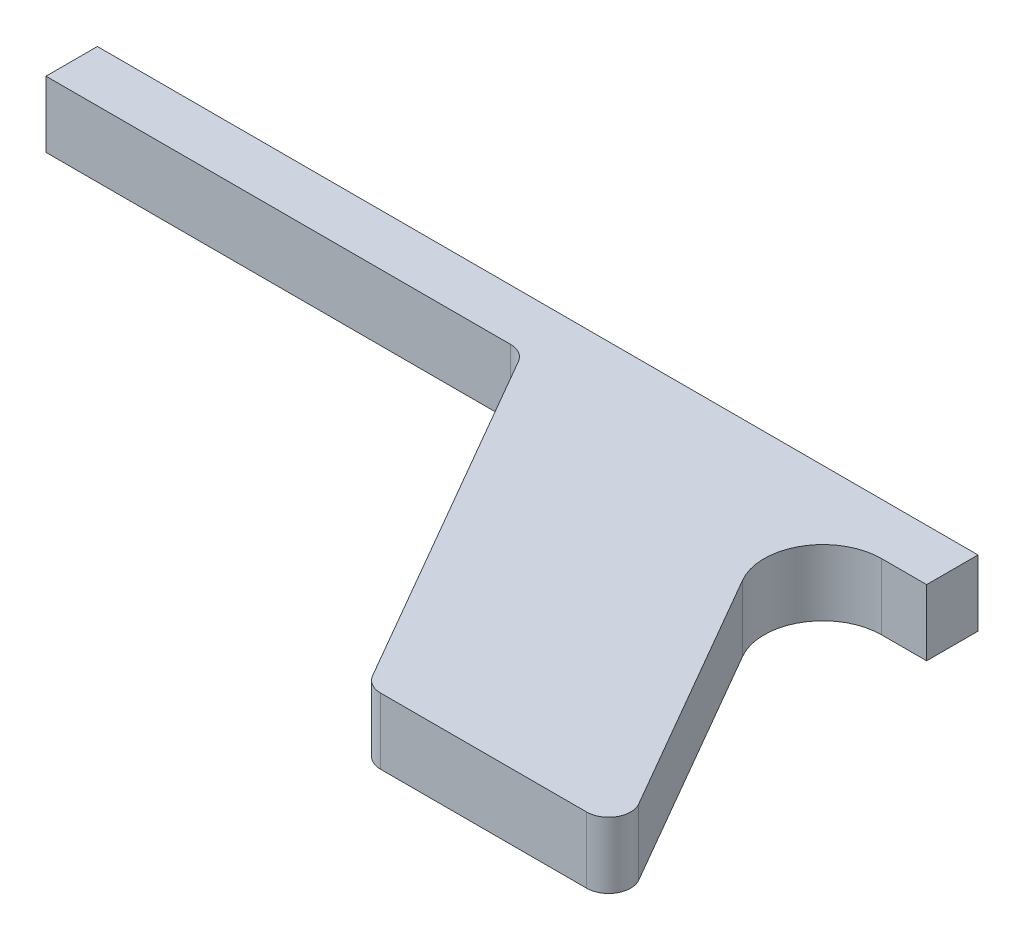
ISO-10303-21;
HEADER;
FILE_DESCRIPTION(('STEP AP214'),'2;1');
FILE_NAME('part.step','',(''),(''),'','','');
FILE_SCHEMA(('AUTOMOTIVE_DESIGN { 1 0 10303 214 1 1 1 1 }'));
ENDSEC;
DATA;
#1=APPLICATION_CONTEXT('core data for automotive mechanical design processes');
#2=APPLICATION_PROTOCOL_DEFINITION('international standard','automotive_design',2000,#1);
#3=PRODUCT_CONTEXT('',#1,'mechanical');
#4=PRODUCT('Part','Part','',(#3));
#5=PRODUCT_RELATED_PRODUCT_CATEGORY('part','',(#4));
#6=PRODUCT_DEFINITION_FORMATION('','',#4);
#7=PRODUCT_DEFINITION_CONTEXT('part definition',#1,'design');
#8=PRODUCT_DEFINITION('design','',#6,#7);
#9=PRODUCT_DEFINITION_SHAPE('','',#8);
#10=(LENGTH_UNIT() NAMED_UNIT(*) SI_UNIT(.MILLI.,.METRE.));
#11=(NAMED_UNIT(*) PLANE_ANGLE_UNIT() SI_UNIT($,.RADIAN.));
#12=(NAMED_UNIT(*) SI_UNIT($,.STERADIAN.) SOLID_ANGLE_UNIT());
#13=UNCERTAINTY_MEASURE_WITH_UNIT(LENGTH_MEASURE(1.E-05),#10,'distance_accuracy_value','');
#14=(GEOMETRIC_REPRESENTATION_CONTEXT(3) GLOBAL_UNCERTAINTY_ASSIGNED_CONTEXT((#13)) GLOBAL_UNIT_ASSIGNED_CONTEXT((#10,
#11,#12)) REPRESENTATION_CONTEXT('',''));
#15=CARTESIAN_POINT('',(0.,0.,0.));
#16=DIRECTION('',(0.,0.,1.));
#17=DIRECTION('',(1.,0.,0.));
#18=AXIS2_PLACEMENT_3D('',#15,#16,#17);
#19=CARTESIAN_POINT('',(26.2499999999997,9.,-15.1554445662277));
#20=DIRECTION('',(0.866025403784436,0.,-0.500000000000004));
#21=DIRECTION('',(-0.500000000000004,0.,-0.866025403784436));
#22=AXIS2_PLACEMENT_3D('',#19,#20,#21);
#23=PLANE('',#22);
#24=DIRECTION('',(0.500000000000004,0.,0.866025403784436));
#25=VECTOR('',#24,1.);
#26=CARTESIAN_POINT('',(26.2499999999997,9.,-15.1554445662277));
#27=LINE('',#26,#25);
#28=CARTESIAN_POINT('',(41.9282032302755,9.,12.));
#29=VERTEX_POINT('',#28);
#30=CARTESIAN_POINT('',(61.2694372481282,9.,45.5000000000002));
#31=VERTEX_POINT('',#30);
#32=EDGE_CURVE('E151',#29,#31,#27,.T.);
#33=ORIENTED_EDGE('',*,*,#32,.T.);
#34=DIRECTION('',(0.,-1.,0.));
#35=VECTOR('',#34,1.);
#36=CARTESIAN_POINT('',(61.2694372481282,0.,45.5000000000002));
#37=LINE('',#36,#35);
#38=CARTESIAN_POINT('',(61.2694372481282,0.,45.5000000000002));
#39=VERTEX_POINT('',#38);
#40=EDGE_CURVE('E218',#31,#39,#37,.T.);
#41=ORIENTED_EDGE('',*,*,#40,.T.);
#42=DIRECTION('',(0.500000000000004,0.,0.866025403784436));
#43=VECTOR('',#42,1.);
#44=CARTESIAN_POINT('',(26.2499999999997,0.,-15.1554445662277));
#45=LINE('',#44,#43);
#46=CARTESIAN_POINT('',(41.9282032302755,0.,12.));
#47=VERTEX_POINT('',#46);
#48=EDGE_CURVE('E172',#47,#39,#45,.T.);
#49=ORIENTED_EDGE('',*,*,#48,.F.);
#50=DIRECTION('',(0.,-1.,0.));
#51=VECTOR('',#50,1.);
#52=CARTESIAN_POINT('',(41.9282032302755,9.,12.));
#53=LINE('',#52,#51);
#54=EDGE_CURVE('E195',#47,#29,#53,.F.);
#55=ORIENTED_EDGE('',*,*,#54,.T.);
#56=EDGE_LOOP('',(#33,#41,#49,#55));
#57=FACE_BOUND('',#56,.T.);
#58=ADVANCED_FACE('F35',(#57),#23,.T.);
#59=CARTESIAN_POINT('',(0.,9.,0.));
#60=DIRECTION('',(0.,0.,1.));
#61=DIRECTION('',(1.,0.,0.));
#62=AXIS2_PLACEMENT_3D('',#59,#60,#61);
#63=PLANE('',#62);
#64=DIRECTION('',(-1.,0.,0.));
#65=VECTOR('',#64,1.);
#66=CARTESIAN_POINT('',(0.,9.,0.));
#67=LINE('',#66,#65);
#68=CARTESIAN_POINT('',(55.,9.,0.));
#69=VERTEX_POINT('',#68);
#70=CARTESIAN_POINT('',(48.8564064605509,9.,0.));
#71=VERTEX_POINT('',#70);
#72=EDGE_CURVE('E131',#69,#71,#67,.T.);
#73=ORIENTED_EDGE('',*,*,#72,.T.);
#74=DIRECTION('',(0.,-1.,0.));
#75=VECTOR('',#74,1.);
#76=CARTESIAN_POINT('',(48.8564064605509,0.,0.));
#77=LINE('',#76,#75);
#78=CARTESIAN_POINT('',(48.8564064605509,0.,0.));
#79=VERTEX_POINT('',#78);
#80=EDGE_CURVE('E137',#71,#79,#77,.T.);
#81=ORIENTED_EDGE('',*,*,#80,.T.);
#82=DIRECTION('',(-1.,0.,0.));
#83=VECTOR('',#82,1.);
#84=CARTESIAN_POINT('',(0.,0.,0.));
#85=LINE('',#84,#83);
#86=CARTESIAN_POINT('',(55.,0.,0.));
#87=VERTEX_POINT('',#86);
#88=EDGE_CURVE('E134',#87,#79,#85,.T.);
#89=ORIENTED_EDGE('',*,*,#88,.F.);
#90=DIRECTION('',(0.,-1.,0.));
#91=VECTOR('',#90,1.);
#92=CARTESIAN_POINT('',(55.,9.,0.));
#93=LINE('',#92,#91);
#94=EDGE_CURVE('E126',#69,#87,#93,.T.);
#95=ORIENTED_EDGE('',*,*,#94,.F.);
#96=EDGE_LOOP('',(#73,#81,#89,#95));
#97=FACE_BOUND('',#96,.T.);
#98=ADVANCED_FACE('F128',(#97),#63,.T.);
#99=CARTESIAN_POINT('',(55.,9.,0.));
#100=DIRECTION('',(-1.,0.,0.));
#101=DIRECTION('',(0.,0.,1.));
#102=AXIS2_PLACEMENT_3D('',#99,#100,#101);
#103=PLANE('',#102);
#104=DIRECTION('',(0.,0.,-1.));
#105=VECTOR('',#104,1.);
#106=CARTESIAN_POINT('',(55.,0.,0.));
#107=LINE('',#106,#105);
#108=CARTESIAN_POINT('',(55.,0.,-6.99999999999977));
#109=VERTEX_POINT('',#108);
#110=EDGE_CURVE('E176',#87,#109,#107,.T.);
#111=ORIENTED_EDGE('',*,*,#110,.T.);
#112=DIRECTION('',(0.,-1.,0.));
#113=VECTOR('',#112,1.);
#114=CARTESIAN_POINT('',(55.,9.,-6.99999999999977));
#115=LINE('',#114,#113);
#116=CARTESIAN_POINT('',(55.,9.,-6.99999999999977));
#117=VERTEX_POINT('',#116);
#118=EDGE_CURVE('E138',#117,#109,#115,.T.);
#119=ORIENTED_EDGE('',*,*,#118,.F.);
#120=DIRECTION('',(0.,0.,-1.));
#121=VECTOR('',#120,1.);
#122=CARTESIAN_POINT('',(55.,9.,0.));
#123=LINE('',#122,#121);
#124=EDGE_CURVE('E141',#69,#117,#123,.T.);
#125=ORIENTED_EDGE('',*,*,#124,.F.);
#126=ORIENTED_EDGE('',*,*,#94,.T.);
#127=EDGE_LOOP('',(#111,#119,#125,#126));
#128=FACE_BOUND('',#127,.T.);
#129=ADVANCED_FACE('F142',(#128),#103,.F.);
#130=CARTESIAN_POINT('',(0.,9.,-6.99999999999977));
#131=DIRECTION('',(0.,0.,1.));
#132=DIRECTION('',(1.,0.,0.));
#133=AXIS2_PLACEMENT_3D('',#130,#131,#132);
#134=PLANE('',#133);
#135=DIRECTION('',(-1.,0.,0.));
#136=VECTOR('',#135,1.);
#137=CARTESIAN_POINT('',(0.,0.,-6.99999999999977));
#138=LINE('',#137,#136);
#139=CARTESIAN_POINT('',(-65.,0.,-6.99999999999976));
#140=VERTEX_POINT('',#139);
#141=EDGE_CURVE('E179',#109,#140,#138,.T.);
#142=ORIENTED_EDGE('',*,*,#141,.T.);
#143=DIRECTION('',(0.,-1.,0.));
#144=VECTOR('',#143,1.);
#145=CARTESIAN_POINT('',(-65.,9.,-6.99999999999976));
#146=LINE('',#145,#144);
#147=CARTESIAN_POINT('',(-65.,9.,-6.99999999999976));
#148=VERTEX_POINT('',#147);
#149=EDGE_CURVE('E191',#148,#140,#146,.T.);
#150=ORIENTED_EDGE('',*,*,#149,.F.);
#151=DIRECTION('',(-1.,0.,0.));
#152=VECTOR('',#151,1.);
#153=CARTESIAN_POINT('',(0.,9.,-6.99999999999977));
#154=LINE('',#153,#152);
#155=EDGE_CURVE('E145',#117,#148,#154,.T.);
#156=ORIENTED_EDGE('',*,*,#155,.F.);
#157=ORIENTED_EDGE('',*,*,#118,.T.);
#158=EDGE_LOOP('',(#142,#150,#156,#157));
#159=FACE_BOUND('',#158,.T.);
#160=ADVANCED_FACE('F266',(#159),#134,.F.);
#161=CARTESIAN_POINT('',(-65.,9.,1.28865172501134E-13));
#162=DIRECTION('',(-1.,0.,0.));
#163=DIRECTION('',(0.,0.,1.));
#164=AXIS2_PLACEMENT_3D('',#161,#162,#163);
#165=PLANE('',#164);
#166=DIRECTION('',(0.,0.,-1.));
#167=VECTOR('',#166,1.);
#168=CARTESIAN_POINT('',(-65.,0.,1.28865172501134E-13));
#169=LINE('',#168,#167);
#170=CARTESIAN_POINT('',(-65.,0.,0.));
#171=VERTEX_POINT('',#170);
#172=EDGE_CURVE('E182',#171,#140,#169,.T.);
#173=ORIENTED_EDGE('',*,*,#172,.F.);
#174=DIRECTION('',(0.,-1.,0.));
#175=VECTOR('',#174,1.);
#176=CARTESIAN_POINT('',(-65.,9.,0.));
#177=LINE('',#176,#175);
#178=CARTESIAN_POINT('',(-65.,9.,0.));
#179=VERTEX_POINT('',#178);
#180=EDGE_CURVE('E171',#179,#171,#177,.T.);
#181=ORIENTED_EDGE('',*,*,#180,.F.);
#182=DIRECTION('',(0.,0.,-1.));
#183=VECTOR('',#182,1.);
#184=CARTESIAN_POINT('',(-65.,9.,1.28865172501134E-13));
#185=LINE('',#184,#183);
#186=EDGE_CURVE('E157',#179,#148,#185,.T.);
#187=ORIENTED_EDGE('',*,*,#186,.T.);
#188=ORIENTED_EDGE('',*,*,#149,.T.);
#189=EDGE_LOOP('',(#173,#181,#187,#188));
#190=FACE_BOUND('',#189,.T.);
#191=ADVANCED_FACE('F269',(#190),#165,.T.);
#192=CARTESIAN_POINT('',(-1.73205080756887,0.,0.));
#193=VERTEX_POINT('',#192);
#194=EDGE_CURVE('E177',#193,#171,#85,.T.);
#195=ORIENTED_EDGE('',*,*,#194,.F.);
#196=DIRECTION('',(0.,-1.,0.));
#197=VECTOR('',#196,1.);
#198=CARTESIAN_POINT('',(-1.73205080756887,9.,0.));
#199=LINE('',#198,#197);
#200=CARTESIAN_POINT('',(-1.73205080756887,9.,0.));
#201=VERTEX_POINT('',#200);
#202=EDGE_CURVE('E205',#193,#201,#199,.F.);
#203=ORIENTED_EDGE('',*,*,#202,.T.);
#204=EDGE_CURVE('E153',#201,#179,#67,.T.);
#205=ORIENTED_EDGE('',*,*,#204,.T.);
#206=ORIENTED_EDGE('',*,*,#180,.T.);
#207=EDGE_LOOP('',(#195,#203,#205,#206));
#208=FACE_BOUND('',#207,.T.);
#209=ADVANCED_FACE('F227',(#208),#63,.T.);
#210=CARTESIAN_POINT('',(0.,9.,0.));
#211=DIRECTION('',(0.866025403784436,0.,-0.500000000000004));
#212=DIRECTION('',(-0.500000000000004,0.,-0.866025403784436));
#213=AXIS2_PLACEMENT_3D('',#210,#211,#212);
#214=PLANE('',#213);
#215=DIRECTION('',(0.500000000000004,0.,0.866025403784436));
#216=VECTOR('',#215,1.);
#217=CARTESIAN_POINT('',(0.,9.,0.));
#218=LINE('',#217,#216);
#219=CARTESIAN_POINT('',(0.866025403784441,9.,1.49999999999999));
#220=VERTEX_POINT('',#219);
#221=CARTESIAN_POINT('',(28.0014880556972,9.,48.5));
#222=VERTEX_POINT('',#221);
#223=EDGE_CURVE('E156',#220,#222,#218,.T.);
#224=ORIENTED_EDGE('',*,*,#223,.F.);
#225=DIRECTION('',(0.,-1.,0.));
#226=VECTOR('',#225,1.);
#227=CARTESIAN_POINT('',(0.866025403784441,9.,1.49999999999999));
#228=LINE('',#227,#226);
#229=CARTESIAN_POINT('',(0.866025403784441,0.,1.49999999999999));
#230=VERTEX_POINT('',#229);
#231=EDGE_CURVE('E202',#220,#230,#228,.T.);
#232=ORIENTED_EDGE('',*,*,#231,.T.);
#233=DIRECTION('',(0.500000000000004,0.,0.866025403784436));
#234=VECTOR('',#233,1.);
#235=CARTESIAN_POINT('',(0.,0.,0.));
#236=LINE('',#235,#234);
#237=CARTESIAN_POINT('',(28.0014880556972,0.,48.5));
#238=VERTEX_POINT('',#237);
#239=EDGE_CURVE('E185',#230,#238,#236,.T.);
#240=ORIENTED_EDGE('',*,*,#239,.T.);
#241=DIRECTION('',(0.,-1.,0.));
#242=VECTOR('',#241,1.);
#243=CARTESIAN_POINT('',(28.0014880556972,9.,48.5));
#244=LINE('',#243,#242);
#245=EDGE_CURVE('E200',#238,#222,#244,.F.);
#246=ORIENTED_EDGE('',*,*,#245,.T.);
#247=EDGE_LOOP('',(#224,#232,#240,#246));
#248=FACE_BOUND('',#247,.T.);
#249=ADVANCED_FACE('F234',(#248),#214,.F.);
#250=CARTESIAN_POINT('',(-3.4694469519536E-13,9.,49.9999999999998));
#251=DIRECTION('',(0.,0.,-1.));
#252=DIRECTION('',(-1.,0.,0.));
#253=AXIS2_PLACEMENT_3D('',#250,#251,#252);
#254=PLANE('',#253);
#255=DIRECTION('',(1.,0.,0.));
#256=VECTOR('',#255,1.);
#257=CARTESIAN_POINT('',(-3.4694469519536E-13,9.,49.9999999999998));
#258=LINE('',#257,#256);
#259=CARTESIAN_POINT('',(30.5995642670505,9.,50.));
#260=VERTEX_POINT('',#259);
#261=CARTESIAN_POINT('',(58.6713610367749,9.,50.0000000000002));
#262=VERTEX_POINT('',#261);
#263=EDGE_CURVE('E162',#260,#262,#258,.T.);
#264=ORIENTED_EDGE('',*,*,#263,.F.);
#265=DIRECTION('',(0.,-1.,0.));
#266=VECTOR('',#265,1.);
#267=CARTESIAN_POINT('',(30.5995642670505,9.,50.));
#268=LINE('',#267,#266);
#269=CARTESIAN_POINT('',(30.5995642670505,0.,50.));
#270=VERTEX_POINT('',#269);
#271=EDGE_CURVE('E209',#260,#270,#268,.T.);
#272=ORIENTED_EDGE('',*,*,#271,.T.);
#273=DIRECTION('',(1.,0.,0.));
#274=VECTOR('',#273,1.);
#275=CARTESIAN_POINT('',(-3.4694469519536E-13,0.,49.9999999999998));
#276=LINE('',#275,#274);
#277=CARTESIAN_POINT('',(58.6713610367749,0.,50.0000000000002));
#278=VERTEX_POINT('',#277);
#279=EDGE_CURVE('E154',#270,#278,#276,.T.);
#280=ORIENTED_EDGE('',*,*,#279,.T.);
#281=DIRECTION('',(0.,-1.,0.));
#282=VECTOR('',#281,1.);
#283=CARTESIAN_POINT('',(58.6713610367749,9.,50.0000000000002));
#284=LINE('',#283,#282);
#285=EDGE_CURVE('E207',#278,#262,#284,.F.);
#286=ORIENTED_EDGE('',*,*,#285,.T.);
#287=EDGE_LOOP('',(#264,#272,#280,#286));
#288=FACE_BOUND('',#287,.T.);
#289=ADVANCED_FACE('F241',(#288),#254,.F.);
#290=CARTESIAN_POINT('',(0.,9.,0.));
#291=DIRECTION('',(0.,1.,0.));
#292=DIRECTION('',(0.,0.,1.));
#293=AXIS2_PLACEMENT_3D('',#290,#291,#292);
#294=PLANE('',#293);
#295=ORIENTED_EDGE('',*,*,#223,.T.);
#296=CARTESIAN_POINT('',(30.5995642670505,9.,47.));
#297=DIRECTION('',(0.,1.,0.));
#298=DIRECTION('',(0.,0.,1.));
#299=AXIS2_PLACEMENT_3D('',#296,#297,#298);
#300=CIRCLE('',#299,3.);
#301=EDGE_CURVE('E216',#222,#260,#300,.T.);
#302=ORIENTED_EDGE('',*,*,#301,.T.);
#303=ORIENTED_EDGE('',*,*,#263,.T.);
#304=CARTESIAN_POINT('',(58.6713610367749,9.,47.0000000000002));
#305=DIRECTION('',(0.,1.,0.));
#306=DIRECTION('',(0.,0.,1.));
#307=AXIS2_PLACEMENT_3D('',#304,#305,#306);
#308=CIRCLE('',#307,3.);
#309=EDGE_CURVE('E50',#262,#31,#308,.T.);
#310=ORIENTED_EDGE('',*,*,#309,.T.);
#311=ORIENTED_EDGE('',*,*,#32,.F.);
#312=CARTESIAN_POINT('',(48.8564064605509,9.,7.99999999999999));
#313=DIRECTION('',(0.,1.,0.));
#314=DIRECTION('',(0.,0.,1.));
#315=AXIS2_PLACEMENT_3D('',#312,#313,#314);
#316=CIRCLE('',#315,8.);
#317=EDGE_CURVE('E150',#29,#71,#316,.F.);
#318=ORIENTED_EDGE('',*,*,#317,.T.);
#319=ORIENTED_EDGE('',*,*,#72,.F.);
#320=ORIENTED_EDGE('',*,*,#124,.T.);
#321=ORIENTED_EDGE('',*,*,#155,.T.);
#322=ORIENTED_EDGE('',*,*,#186,.F.);
#323=ORIENTED_EDGE('',*,*,#204,.F.);
#324=CARTESIAN_POINT('',(-1.73205080756887,9.,3.));
#325=DIRECTION('',(0.,1.,0.));
#326=DIRECTION('',(0.,0.,1.));
#327=AXIS2_PLACEMENT_3D('',#324,#325,#326);
#328=CIRCLE('',#327,3.);
#329=EDGE_CURVE('E11',#201,#220,#328,.F.);
#330=ORIENTED_EDGE('',*,*,#329,.T.);
#331=EDGE_LOOP('',(#295,#302,#303,#310,#311,#318,#319,#320,#321,#322,#323,#330));
#332=FACE_BOUND('',#331,.T.);
#333=ADVANCED_FACE('F148',(#332),#294,.T.);
#334=CARTESIAN_POINT('',(0.,0.,0.));
#335=DIRECTION('',(0.,1.,0.));
#336=DIRECTION('',(0.,0.,1.));
#337=AXIS2_PLACEMENT_3D('',#334,#335,#336);
#338=PLANE('',#337);
#339=ORIENTED_EDGE('',*,*,#279,.F.);
#340=CARTESIAN_POINT('',(30.5995642670505,0.,47.));
#341=DIRECTION('',(0.,1.,0.));
#342=DIRECTION('',(0.,0.,1.));
#343=AXIS2_PLACEMENT_3D('',#340,#341,#342);
#344=CIRCLE('',#343,3.);
#345=EDGE_CURVE('E213',#270,#238,#344,.F.);
#346=ORIENTED_EDGE('',*,*,#345,.T.);
#347=ORIENTED_EDGE('',*,*,#239,.F.);
#348=CARTESIAN_POINT('',(-1.73205080756887,0.,3.));
#349=DIRECTION('',(0.,1.,0.));
#350=DIRECTION('',(0.,0.,1.));
#351=AXIS2_PLACEMENT_3D('',#348,#349,#350);
#352=CIRCLE('',#351,3.);
#353=EDGE_CURVE('E43',#230,#193,#352,.T.);
#354=ORIENTED_EDGE('',*,*,#353,.T.);
#355=ORIENTED_EDGE('',*,*,#194,.T.);
#356=ORIENTED_EDGE('',*,*,#172,.T.);
#357=ORIENTED_EDGE('',*,*,#141,.F.);
#358=ORIENTED_EDGE('',*,*,#110,.F.);
#359=ORIENTED_EDGE('',*,*,#88,.T.);
#360=CARTESIAN_POINT('',(48.8564064605509,0.,7.99999999999999));
#361=DIRECTION('',(0.,1.,0.));
#362=DIRECTION('',(0.,0.,1.));
#363=AXIS2_PLACEMENT_3D('',#360,#361,#362);
#364=CIRCLE('',#363,8.);
#365=EDGE_CURVE('E197',#79,#47,#364,.T.);
#366=ORIENTED_EDGE('',*,*,#365,.T.);
#367=ORIENTED_EDGE('',*,*,#48,.T.);
#368=CARTESIAN_POINT('',(58.6713610367749,0.,47.0000000000002));
#369=DIRECTION('',(0.,1.,0.));
#370=DIRECTION('',(0.,0.,1.));
#371=AXIS2_PLACEMENT_3D('',#368,#369,#370);
#372=CIRCLE('',#371,3.);
#373=EDGE_CURVE('E58',#39,#278,#372,.F.);
#374=ORIENTED_EDGE('',*,*,#373,.T.);
#375=EDGE_LOOP('',(#339,#346,#347,#354,#355,#356,#357,#358,#359,#366,#367,#374));
#376=FACE_BOUND('',#375,.T.);
#377=ADVANCED_FACE('F223',(#376),#338,.F.);
#378=CARTESIAN_POINT('',(48.8564064605509,9.,7.99999999999999));
#379=DIRECTION('',(0.,1.,0.));
#380=DIRECTION('',(0.,0.,1.));
#381=AXIS2_PLACEMENT_3D('',#378,#379,#380);
#382=CYLINDRICAL_SURFACE('',#381,8.);
#383=ORIENTED_EDGE('',*,*,#317,.F.);
#384=ORIENTED_EDGE('',*,*,#54,.F.);
#385=ORIENTED_EDGE('',*,*,#365,.F.);
#386=ORIENTED_EDGE('',*,*,#80,.F.);
#387=EDGE_LOOP('',(#383,#384,#385,#386));
#388=FACE_BOUND('',#387,.T.);
#389=ADVANCED_FACE('F246',(#388),#382,.F.);
#390=CARTESIAN_POINT('',(-1.73205080756887,9.,3.));
#391=DIRECTION('',(0.,-1.,0.));
#392=DIRECTION('',(0.,0.,-1.));
#393=AXIS2_PLACEMENT_3D('',#390,#391,#392);
#394=CYLINDRICAL_SURFACE('',#393,3.);
#395=ORIENTED_EDGE('',*,*,#329,.F.);
#396=ORIENTED_EDGE('',*,*,#202,.F.);
#397=ORIENTED_EDGE('',*,*,#353,.F.);
#398=ORIENTED_EDGE('',*,*,#231,.F.);
#399=EDGE_LOOP('',(#395,#396,#397,#398));
#400=FACE_BOUND('',#399,.T.);
#401=ADVANCED_FACE('F230',(#400),#394,.F.);
#402=CARTESIAN_POINT('',(30.5995642670505,9.,47.));
#403=DIRECTION('',(0.,-1.,0.));
#404=DIRECTION('',(0.,0.,-1.));
#405=AXIS2_PLACEMENT_3D('',#402,#403,#404);
#406=CYLINDRICAL_SURFACE('',#405,3.);
#407=ORIENTED_EDGE('',*,*,#301,.F.);
#408=ORIENTED_EDGE('',*,*,#245,.F.);
#409=ORIENTED_EDGE('',*,*,#345,.F.);
#410=ORIENTED_EDGE('',*,*,#271,.F.);
#411=EDGE_LOOP('',(#407,#408,#409,#410));
#412=FACE_BOUND('',#411,.T.);
#413=ADVANCED_FACE('F237',(#412),#406,.T.);
#414=CARTESIAN_POINT('',(58.6713610367749,9.,47.0000000000002));
#415=DIRECTION('',(0.,1.,0.));
#416=DIRECTION('',(0.,0.,1.));
#417=AXIS2_PLACEMENT_3D('',#414,#415,#416);
#418=CYLINDRICAL_SURFACE('',#417,3.);
#419=ORIENTED_EDGE('',*,*,#309,.F.);
#420=ORIENTED_EDGE('',*,*,#285,.F.);
#421=ORIENTED_EDGE('',*,*,#373,.F.);
#422=ORIENTED_EDGE('',*,*,#40,.F.);
#423=EDGE_LOOP('',(#419,#420,#421,#422));
#424=FACE_BOUND('',#423,.T.);
#425=ADVANCED_FACE('F37',(#424),#418,.T.);
#426=CLOSED_SHELL('',(#58,#98,#129,#160,#191,#209,#249,#289,#333,#377,#389,#401,#413,#425));
#427=MANIFOLD_SOLID_BREP('B2',#426);
#428=ADVANCED_BREP_SHAPE_REPRESENTATION('',(#18,#427),#14);
#429=SHAPE_DEFINITION_REPRESENTATION(#9,#428);
ENDSEC;
END-ISO-10303-21;
